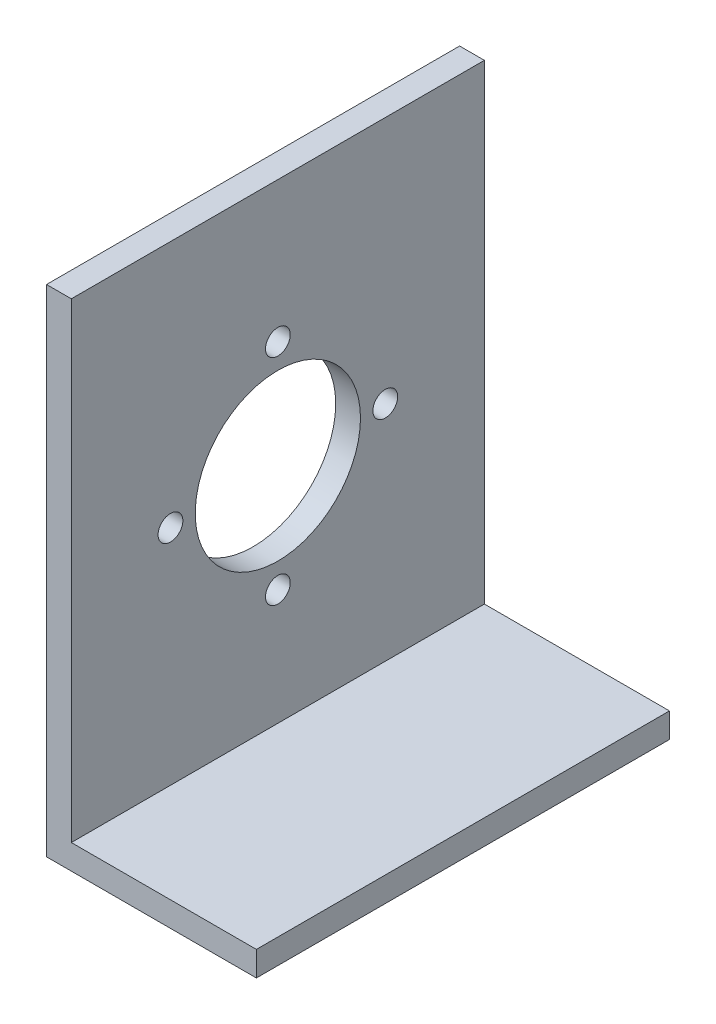
ISO-10303-21;
HEADER;
FILE_DESCRIPTION(('STEP AP214'),'2;1');
FILE_NAME('part.step','',(''),(''),'','','');
FILE_SCHEMA(('AUTOMOTIVE_DESIGN { 1 0 10303 214 1 1 1 1 }'));
ENDSEC;
DATA;
#1=APPLICATION_CONTEXT('core data for automotive mechanical design processes');
#2=APPLICATION_PROTOCOL_DEFINITION('international standard','automotive_design',2000,#1);
#3=PRODUCT_CONTEXT('',#1,'mechanical');
#4=PRODUCT('Part','Part','',(#3));
#5=PRODUCT_RELATED_PRODUCT_CATEGORY('part','',(#4));
#6=PRODUCT_DEFINITION_FORMATION('','',#4);
#7=PRODUCT_DEFINITION_CONTEXT('part definition',#1,'design');
#8=PRODUCT_DEFINITION('design','',#6,#7);
#9=PRODUCT_DEFINITION_SHAPE('','',#8);
#10=(LENGTH_UNIT() NAMED_UNIT(*) SI_UNIT(.MILLI.,.METRE.));
#11=(NAMED_UNIT(*) PLANE_ANGLE_UNIT() SI_UNIT($,.RADIAN.));
#12=(NAMED_UNIT(*) SI_UNIT($,.STERADIAN.) SOLID_ANGLE_UNIT());
#13=UNCERTAINTY_MEASURE_WITH_UNIT(LENGTH_MEASURE(1.E-05),#10,'distance_accuracy_value','');
#14=(GEOMETRIC_REPRESENTATION_CONTEXT(3) GLOBAL_UNCERTAINTY_ASSIGNED_CONTEXT((#13)) GLOBAL_UNIT_ASSIGNED_CONTEXT((#10,
#11,#12)) REPRESENTATION_CONTEXT('',''));
#15=CARTESIAN_POINT('',(0.,0.,0.));
#16=DIRECTION('',(0.,0.,1.));
#17=DIRECTION('',(1.,0.,0.));
#18=AXIS2_PLACEMENT_3D('',#15,#16,#17);
#19=CARTESIAN_POINT('',(3.,0.,50.));
#20=DIRECTION('',(0.,-1.,0.));
#21=DIRECTION('',(0.,0.,-1.));
#22=AXIS2_PLACEMENT_3D('',#19,#20,#21);
#23=PLANE('',#22);
#24=DIRECTION('',(-1.,0.,0.));
#25=VECTOR('',#24,1.);
#26=CARTESIAN_POINT('',(3.,0.,0.));
#27=LINE('',#26,#25);
#28=CARTESIAN_POINT('',(3.,0.,0.));
#29=VERTEX_POINT('',#28);
#30=CARTESIAN_POINT('',(0.,0.,0.));
#31=VERTEX_POINT('',#30);
#32=EDGE_CURVE('E116',#29,#31,#27,.T.);
#33=ORIENTED_EDGE('',*,*,#32,.T.);
#34=DIRECTION('',(0.,0.,-1.));
#35=VECTOR('',#34,1.);
#36=CARTESIAN_POINT('',(0.,0.,50.));
#37=LINE('',#36,#35);
#38=CARTESIAN_POINT('',(0.,0.,50.));
#39=VERTEX_POINT('',#38);
#40=EDGE_CURVE('E11',#39,#31,#37,.T.);
#41=ORIENTED_EDGE('',*,*,#40,.F.);
#42=DIRECTION('',(-1.,0.,0.));
#43=VECTOR('',#42,1.);
#44=CARTESIAN_POINT('',(3.,0.,50.));
#45=LINE('',#44,#43);
#46=CARTESIAN_POINT('',(3.,0.,50.));
#47=VERTEX_POINT('',#46);
#48=EDGE_CURVE('E127',#47,#39,#45,.T.);
#49=ORIENTED_EDGE('',*,*,#48,.F.);
#50=DIRECTION('',(0.,0.,-1.));
#51=VECTOR('',#50,1.);
#52=CARTESIAN_POINT('',(3.,0.,50.));
#53=LINE('',#52,#51);
#54=EDGE_CURVE('E112',#47,#29,#53,.T.);
#55=ORIENTED_EDGE('',*,*,#54,.T.);
#56=EDGE_LOOP('',(#33,#41,#49,#55));
#57=FACE_BOUND('',#56,.T.);
#58=ADVANCED_FACE('F32',(#57),#23,.F.);
#59=CARTESIAN_POINT('',(0.,0.,50.));
#60=DIRECTION('',(1.,0.,0.));
#61=DIRECTION('',(0.,1.,0.));
#62=AXIS2_PLACEMENT_3D('',#59,#60,#61);
#63=PLANE('',#62);
#64=CARTESIAN_POINT('',(0.,-17.,25.));
#65=DIRECTION('',(1.,0.,0.));
#66=DIRECTION('',(0.,1.,0.));
#67=AXIS2_PLACEMENT_3D('',#64,#65,#66);
#68=CIRCLE('',#67,1.5);
#69=CARTESIAN_POINT('',(0.,-15.5,25.));
#70=VERTEX_POINT('',#69);
#71=EDGE_CURVE('E120',#70,#70,#68,.T.);
#72=ORIENTED_EDGE('',*,*,#71,.T.);
#73=EDGE_LOOP('',(#72));
#74=FACE_BOUND('',#73,.T.);
#75=CARTESIAN_POINT('',(0.,-29.9999999999999,11.9999999999998));
#76=DIRECTION('',(1.,0.,0.));
#77=DIRECTION('',(0.,1.,0.));
#78=AXIS2_PLACEMENT_3D('',#75,#76,#77);
#79=CIRCLE('',#78,1.5);
#80=CARTESIAN_POINT('',(0.,-28.4999999999999,11.9999999999998));
#81=VERTEX_POINT('',#80);
#82=EDGE_CURVE('E256',#81,#81,#79,.T.);
#83=ORIENTED_EDGE('',*,*,#82,.T.);
#84=EDGE_LOOP('',(#83));
#85=FACE_BOUND('',#84,.T.);
#86=CARTESIAN_POINT('',(0.,-43.,24.9999999999997));
#87=DIRECTION('',(1.,0.,0.));
#88=DIRECTION('',(0.,1.,0.));
#89=AXIS2_PLACEMENT_3D('',#86,#87,#88);
#90=CIRCLE('',#89,1.5);
#91=CARTESIAN_POINT('',(0.,-41.5,24.9999999999997));
#92=VERTEX_POINT('',#91);
#93=EDGE_CURVE('E259',#92,#92,#90,.T.);
#94=ORIENTED_EDGE('',*,*,#93,.T.);
#95=EDGE_LOOP('',(#94));
#96=FACE_BOUND('',#95,.T.);
#97=CARTESIAN_POINT('',(0.,-30.0000000000001,37.9999999999998));
#98=DIRECTION('',(1.,0.,0.));
#99=DIRECTION('',(0.,1.,0.));
#100=AXIS2_PLACEMENT_3D('',#97,#98,#99);
#101=CIRCLE('',#100,1.5);
#102=CARTESIAN_POINT('',(0.,-28.5000000000001,37.9999999999998));
#103=VERTEX_POINT('',#102);
#104=EDGE_CURVE('E266',#103,#103,#101,.T.);
#105=ORIENTED_EDGE('',*,*,#104,.T.);
#106=EDGE_LOOP('',(#105));
#107=FACE_BOUND('',#106,.T.);
#108=CARTESIAN_POINT('',(0.,-30.,25.));
#109=DIRECTION('',(1.,0.,0.));
#110=DIRECTION('',(0.,1.,0.));
#111=AXIS2_PLACEMENT_3D('',#108,#109,#110);
#112=CIRCLE('',#111,10.);
#113=CARTESIAN_POINT('',(0.,-20.,25.));
#114=VERTEX_POINT('',#113);
#115=EDGE_CURVE('E269',#114,#114,#112,.T.);
#116=ORIENTED_EDGE('',*,*,#115,.T.);
#117=EDGE_LOOP('',(#116));
#118=FACE_BOUND('',#117,.T.);
#119=DIRECTION('',(0.,-1.,0.));
#120=VECTOR('',#119,1.);
#121=CARTESIAN_POINT('',(0.,0.,0.));
#122=LINE('',#121,#120);
#123=CARTESIAN_POINT('',(0.,-60.,0.));
#124=VERTEX_POINT('',#123);
#125=EDGE_CURVE('E119',#31,#124,#122,.T.);
#126=ORIENTED_EDGE('',*,*,#125,.T.);
#127=DIRECTION('',(0.,0.,-1.));
#128=VECTOR('',#127,1.);
#129=CARTESIAN_POINT('',(0.,-60.,50.));
#130=LINE('',#129,#128);
#131=CARTESIAN_POINT('',(0.,-60.,50.));
#132=VERTEX_POINT('',#131);
#133=EDGE_CURVE('E40',#132,#124,#130,.T.);
#134=ORIENTED_EDGE('',*,*,#133,.F.);
#135=DIRECTION('',(0.,-1.,0.));
#136=VECTOR('',#135,1.);
#137=CARTESIAN_POINT('',(0.,0.,50.));
#138=LINE('',#137,#136);
#139=EDGE_CURVE('E85',#39,#132,#138,.T.);
#140=ORIENTED_EDGE('',*,*,#139,.F.);
#141=ORIENTED_EDGE('',*,*,#40,.T.);
#142=EDGE_LOOP('',(#126,#134,#140,#141));
#143=FACE_BOUND('',#142,.T.);
#144=ADVANCED_FACE('F154',(#74,#85,#96,#107,#118,#143),#63,.F.);
#145=CARTESIAN_POINT('',(0.,-60.,50.));
#146=DIRECTION('',(0.,1.,0.));
#147=DIRECTION('',(0.,0.,1.));
#148=AXIS2_PLACEMENT_3D('',#145,#146,#147);
#149=PLANE('',#148);
#150=DIRECTION('',(1.,0.,0.));
#151=VECTOR('',#150,1.);
#152=CARTESIAN_POINT('',(0.,-60.,0.));
#153=LINE('',#152,#151);
#154=CARTESIAN_POINT('',(25.4,-60.,0.));
#155=VERTEX_POINT('',#154);
#156=EDGE_CURVE('E122',#124,#155,#153,.T.);
#157=ORIENTED_EDGE('',*,*,#156,.T.);
#158=DIRECTION('',(0.,0.,-1.));
#159=VECTOR('',#158,1.);
#160=CARTESIAN_POINT('',(25.4,-60.,50.));
#161=LINE('',#160,#159);
#162=CARTESIAN_POINT('',(25.4,-60.,50.));
#163=VERTEX_POINT('',#162);
#164=EDGE_CURVE('E107',#163,#155,#161,.T.);
#165=ORIENTED_EDGE('',*,*,#164,.F.);
#166=DIRECTION('',(1.,0.,0.));
#167=VECTOR('',#166,1.);
#168=CARTESIAN_POINT('',(0.,-60.,50.));
#169=LINE('',#168,#167);
#170=EDGE_CURVE('E98',#132,#163,#169,.T.);
#171=ORIENTED_EDGE('',*,*,#170,.F.);
#172=ORIENTED_EDGE('',*,*,#133,.T.);
#173=EDGE_LOOP('',(#157,#165,#171,#172));
#174=FACE_BOUND('',#173,.T.);
#175=ADVANCED_FACE('F133',(#174),#149,.F.);
#176=CARTESIAN_POINT('',(25.4,-57.,50.));
#177=DIRECTION('',(-1.,0.,0.));
#178=DIRECTION('',(0.,0.,1.));
#179=AXIS2_PLACEMENT_3D('',#176,#177,#178);
#180=PLANE('',#179);
#181=DIRECTION('',(0.,1.,0.));
#182=VECTOR('',#181,1.);
#183=CARTESIAN_POINT('',(25.4,-57.,0.));
#184=LINE('',#183,#182);
#185=CARTESIAN_POINT('',(25.4,-57.,0.));
#186=VERTEX_POINT('',#185);
#187=EDGE_CURVE('E106',#155,#186,#184,.T.);
#188=ORIENTED_EDGE('',*,*,#187,.T.);
#189=DIRECTION('',(0.,0.,-1.));
#190=VECTOR('',#189,1.);
#191=CARTESIAN_POINT('',(25.4,-57.,50.));
#192=LINE('',#191,#190);
#193=CARTESIAN_POINT('',(25.4,-57.,50.));
#194=VERTEX_POINT('',#193);
#195=EDGE_CURVE('E103',#194,#186,#192,.T.);
#196=ORIENTED_EDGE('',*,*,#195,.F.);
#197=DIRECTION('',(0.,1.,0.));
#198=VECTOR('',#197,1.);
#199=CARTESIAN_POINT('',(25.4,-57.,50.));
#200=LINE('',#199,#198);
#201=EDGE_CURVE('E92',#163,#194,#200,.T.);
#202=ORIENTED_EDGE('',*,*,#201,.F.);
#203=ORIENTED_EDGE('',*,*,#164,.T.);
#204=EDGE_LOOP('',(#188,#196,#202,#203));
#205=FACE_BOUND('',#204,.T.);
#206=ADVANCED_FACE('F104',(#205),#180,.F.);
#207=CARTESIAN_POINT('',(3.,-57.,50.));
#208=DIRECTION('',(0.,-1.,0.));
#209=DIRECTION('',(0.,0.,-1.));
#210=AXIS2_PLACEMENT_3D('',#207,#208,#209);
#211=PLANE('',#210);
#212=DIRECTION('',(-1.,0.,0.));
#213=VECTOR('',#212,1.);
#214=CARTESIAN_POINT('',(3.,-57.,0.));
#215=LINE('',#214,#213);
#216=CARTESIAN_POINT('',(3.,-57.,0.));
#217=VERTEX_POINT('',#216);
#218=EDGE_CURVE('E71',#186,#217,#215,.T.);
#219=ORIENTED_EDGE('',*,*,#218,.T.);
#220=DIRECTION('',(0.,0.,-1.));
#221=VECTOR('',#220,1.);
#222=CARTESIAN_POINT('',(3.,-57.,50.));
#223=LINE('',#222,#221);
#224=CARTESIAN_POINT('',(3.,-57.,50.));
#225=VERTEX_POINT('',#224);
#226=EDGE_CURVE('E108',#225,#217,#223,.T.);
#227=ORIENTED_EDGE('',*,*,#226,.F.);
#228=DIRECTION('',(-1.,0.,0.));
#229=VECTOR('',#228,1.);
#230=CARTESIAN_POINT('',(3.,-57.,50.));
#231=LINE('',#230,#229);
#232=EDGE_CURVE('E96',#194,#225,#231,.T.);
#233=ORIENTED_EDGE('',*,*,#232,.F.);
#234=ORIENTED_EDGE('',*,*,#195,.T.);
#235=EDGE_LOOP('',(#219,#227,#233,#234));
#236=FACE_BOUND('',#235,.T.);
#237=ADVANCED_FACE('F110',(#236),#211,.F.);
#238=CARTESIAN_POINT('',(3.,0.,50.));
#239=DIRECTION('',(-1.,0.,0.));
#240=DIRECTION('',(0.,0.,1.));
#241=AXIS2_PLACEMENT_3D('',#238,#239,#240);
#242=PLANE('',#241);
#243=CARTESIAN_POINT('',(3.,-17.,25.));
#244=DIRECTION('',(1.,0.,0.));
#245=DIRECTION('',(0.,0.,-1.));
#246=AXIS2_PLACEMENT_3D('',#243,#244,#245);
#247=CIRCLE('',#246,1.5);
#248=CARTESIAN_POINT('',(3.,-17.,23.5));
#249=VERTEX_POINT('',#248);
#250=EDGE_CURVE('E254',#249,#249,#247,.T.);
#251=ORIENTED_EDGE('',*,*,#250,.F.);
#252=EDGE_LOOP('',(#251));
#253=FACE_BOUND('',#252,.T.);
#254=CARTESIAN_POINT('',(3.,-29.9999999999999,11.9999999999998));
#255=DIRECTION('',(1.,0.,0.));
#256=DIRECTION('',(0.,0.,-1.));
#257=AXIS2_PLACEMENT_3D('',#254,#255,#256);
#258=CIRCLE('',#257,1.5);
#259=CARTESIAN_POINT('',(3.,-29.9999999999999,10.4999999999998));
#260=VERTEX_POINT('',#259);
#261=EDGE_CURVE('E275',#260,#260,#258,.T.);
#262=ORIENTED_EDGE('',*,*,#261,.F.);
#263=EDGE_LOOP('',(#262));
#264=FACE_BOUND('',#263,.T.);
#265=CARTESIAN_POINT('',(3.,-43.,24.9999999999997));
#266=DIRECTION('',(1.,0.,0.));
#267=DIRECTION('',(0.,0.,-1.));
#268=AXIS2_PLACEMENT_3D('',#265,#266,#267);
#269=CIRCLE('',#268,1.5);
#270=CARTESIAN_POINT('',(3.,-43.,23.4999999999997));
#271=VERTEX_POINT('',#270);
#272=EDGE_CURVE('E278',#271,#271,#269,.T.);
#273=ORIENTED_EDGE('',*,*,#272,.F.);
#274=EDGE_LOOP('',(#273));
#275=FACE_BOUND('',#274,.T.);
#276=CARTESIAN_POINT('',(3.,-30.0000000000001,37.9999999999998));
#277=DIRECTION('',(1.,0.,0.));
#278=DIRECTION('',(0.,0.,-1.));
#279=AXIS2_PLACEMENT_3D('',#276,#277,#278);
#280=CIRCLE('',#279,1.5);
#281=CARTESIAN_POINT('',(3.,-30.0000000000001,36.4999999999998));
#282=VERTEX_POINT('',#281);
#283=EDGE_CURVE('E280',#282,#282,#280,.T.);
#284=ORIENTED_EDGE('',*,*,#283,.F.);
#285=EDGE_LOOP('',(#284));
#286=FACE_BOUND('',#285,.T.);
#287=CARTESIAN_POINT('',(3.,-30.,25.));
#288=DIRECTION('',(1.,0.,0.));
#289=DIRECTION('',(0.,0.,-1.));
#290=AXIS2_PLACEMENT_3D('',#287,#288,#289);
#291=CIRCLE('',#290,10.);
#292=CARTESIAN_POINT('',(3.,-30.,15.));
#293=VERTEX_POINT('',#292);
#294=EDGE_CURVE('E272',#293,#293,#291,.T.);
#295=ORIENTED_EDGE('',*,*,#294,.F.);
#296=EDGE_LOOP('',(#295));
#297=FACE_BOUND('',#296,.T.);
#298=DIRECTION('',(0.,1.,0.));
#299=VECTOR('',#298,1.);
#300=CARTESIAN_POINT('',(3.,0.,0.));
#301=LINE('',#300,#299);
#302=EDGE_CURVE('E77',#217,#29,#301,.T.);
#303=ORIENTED_EDGE('',*,*,#302,.T.);
#304=ORIENTED_EDGE('',*,*,#54,.F.);
#305=DIRECTION('',(0.,1.,0.));
#306=VECTOR('',#305,1.);
#307=CARTESIAN_POINT('',(3.,0.,50.));
#308=LINE('',#307,#306);
#309=EDGE_CURVE('E48',#225,#47,#308,.T.);
#310=ORIENTED_EDGE('',*,*,#309,.F.);
#311=ORIENTED_EDGE('',*,*,#226,.T.);
#312=EDGE_LOOP('',(#303,#304,#310,#311));
#313=FACE_BOUND('',#312,.T.);
#314=ADVANCED_FACE('F140',(#253,#264,#275,#286,#297,#313),#242,.F.);
#315=CARTESIAN_POINT('',(0.,0.,50.));
#316=DIRECTION('',(0.,0.,1.));
#317=DIRECTION('',(1.,0.,0.));
#318=AXIS2_PLACEMENT_3D('',#315,#316,#317);
#319=PLANE('',#318);
#320=ORIENTED_EDGE('',*,*,#48,.T.);
#321=ORIENTED_EDGE('',*,*,#139,.T.);
#322=ORIENTED_EDGE('',*,*,#170,.T.);
#323=ORIENTED_EDGE('',*,*,#201,.T.);
#324=ORIENTED_EDGE('',*,*,#232,.T.);
#325=ORIENTED_EDGE('',*,*,#309,.T.);
#326=EDGE_LOOP('',(#320,#321,#322,#323,#324,#325));
#327=FACE_BOUND('',#326,.T.);
#328=ADVANCED_FACE('F94',(#327),#319,.T.);
#329=CARTESIAN_POINT('',(0.,0.,0.));
#330=DIRECTION('',(0.,0.,1.));
#331=DIRECTION('',(1.,0.,0.));
#332=AXIS2_PLACEMENT_3D('',#329,#330,#331);
#333=PLANE('',#332);
#334=ORIENTED_EDGE('',*,*,#32,.F.);
#335=ORIENTED_EDGE('',*,*,#302,.F.);
#336=ORIENTED_EDGE('',*,*,#218,.F.);
#337=ORIENTED_EDGE('',*,*,#187,.F.);
#338=ORIENTED_EDGE('',*,*,#156,.F.);
#339=ORIENTED_EDGE('',*,*,#125,.F.);
#340=EDGE_LOOP('',(#334,#335,#336,#337,#338,#339));
#341=FACE_BOUND('',#340,.T.);
#342=ADVANCED_FACE('F136',(#341),#333,.F.);
#343=CARTESIAN_POINT('',(-47.,-30.,25.));
#344=DIRECTION('',(1.,0.,0.));
#345=DIRECTION('',(0.,0.,-1.));
#346=AXIS2_PLACEMENT_3D('',#343,#344,#345);
#347=CYLINDRICAL_SURFACE('',#346,10.);
#348=ORIENTED_EDGE('',*,*,#294,.T.);
#349=EDGE_LOOP('',(#348));
#350=FACE_BOUND('',#349,.T.);
#351=ORIENTED_EDGE('',*,*,#115,.F.);
#352=EDGE_LOOP('',(#351));
#353=FACE_BOUND('',#352,.T.);
#354=ADVANCED_FACE('F190',(#350,#353),#347,.F.);
#355=CARTESIAN_POINT('',(-47.,-30.0000000000001,37.9999999999998));
#356=DIRECTION('',(1.,0.,0.));
#357=DIRECTION('',(0.,0.,-1.));
#358=AXIS2_PLACEMENT_3D('',#355,#356,#357);
#359=CYLINDRICAL_SURFACE('',#358,1.5);
#360=ORIENTED_EDGE('',*,*,#283,.T.);
#361=EDGE_LOOP('',(#360));
#362=FACE_BOUND('',#361,.T.);
#363=ORIENTED_EDGE('',*,*,#104,.F.);
#364=EDGE_LOOP('',(#363));
#365=FACE_BOUND('',#364,.T.);
#366=ADVANCED_FACE('F208',(#362,#365),#359,.F.);
#367=CARTESIAN_POINT('',(-47.,-43.,24.9999999999997));
#368=DIRECTION('',(1.,0.,0.));
#369=DIRECTION('',(0.,0.,-1.));
#370=AXIS2_PLACEMENT_3D('',#367,#368,#369);
#371=CYLINDRICAL_SURFACE('',#370,1.5);
#372=ORIENTED_EDGE('',*,*,#272,.T.);
#373=EDGE_LOOP('',(#372));
#374=FACE_BOUND('',#373,.T.);
#375=ORIENTED_EDGE('',*,*,#93,.F.);
#376=EDGE_LOOP('',(#375));
#377=FACE_BOUND('',#376,.T.);
#378=ADVANCED_FACE('F218',(#374,#377),#371,.F.);
#379=CARTESIAN_POINT('',(-47.,-29.9999999999999,11.9999999999998));
#380=DIRECTION('',(1.,0.,0.));
#381=DIRECTION('',(0.,0.,-1.));
#382=AXIS2_PLACEMENT_3D('',#379,#380,#381);
#383=CYLINDRICAL_SURFACE('',#382,1.5);
#384=ORIENTED_EDGE('',*,*,#261,.T.);
#385=EDGE_LOOP('',(#384));
#386=FACE_BOUND('',#385,.T.);
#387=ORIENTED_EDGE('',*,*,#82,.F.);
#388=EDGE_LOOP('',(#387));
#389=FACE_BOUND('',#388,.T.);
#390=ADVANCED_FACE('F228',(#386,#389),#383,.F.);
#391=CARTESIAN_POINT('',(-47.,-17.,25.));
#392=DIRECTION('',(1.,0.,0.));
#393=DIRECTION('',(0.,0.,-1.));
#394=AXIS2_PLACEMENT_3D('',#391,#392,#393);
#395=CYLINDRICAL_SURFACE('',#394,1.5);
#396=ORIENTED_EDGE('',*,*,#250,.T.);
#397=EDGE_LOOP('',(#396));
#398=FACE_BOUND('',#397,.T.);
#399=ORIENTED_EDGE('',*,*,#71,.F.);
#400=EDGE_LOOP('',(#399));
#401=FACE_BOUND('',#400,.T.);
#402=ADVANCED_FACE('F238',(#398,#401),#395,.F.);
#403=CLOSED_SHELL('',(#58,#144,#175,#206,#237,#314,#328,#342,#354,#366,#378,#390,#402));
#404=MANIFOLD_SOLID_BREP('B2',#403);
#405=ADVANCED_BREP_SHAPE_REPRESENTATION('',(#18,#404),#14);
#406=SHAPE_DEFINITION_REPRESENTATION(#9,#405);
ENDSEC;
END-ISO-10303-21;
